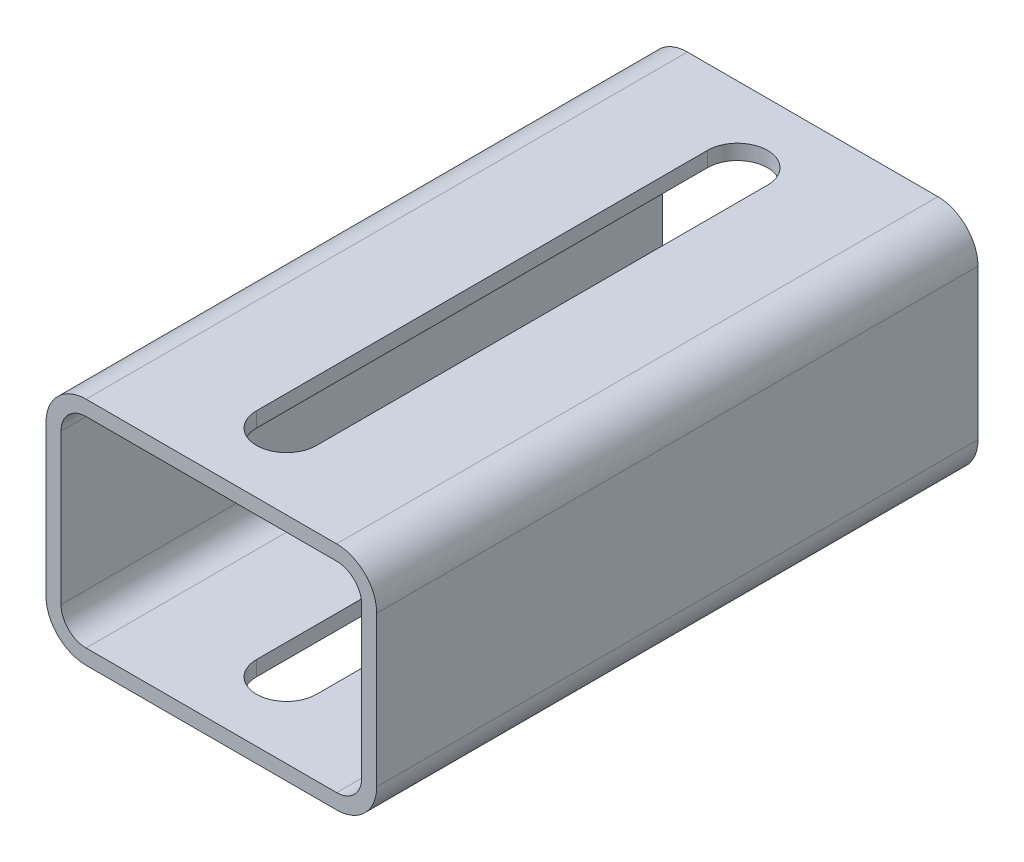
ISO-10303-21;
HEADER;
FILE_DESCRIPTION(('STEP AP214'),'2;1');
FILE_NAME('part.step','',(''),(''),'','','');
FILE_SCHEMA(('AUTOMOTIVE_DESIGN { 1 0 10303 214 1 1 1 1 }'));
ENDSEC;
DATA;
#1=APPLICATION_CONTEXT('core data for automotive mechanical design processes');
#2=APPLICATION_PROTOCOL_DEFINITION('international standard','automotive_design',2000,#1);
#3=PRODUCT_CONTEXT('',#1,'mechanical');
#4=PRODUCT('Part','Part','',(#3));
#5=PRODUCT_RELATED_PRODUCT_CATEGORY('part','',(#4));
#6=PRODUCT_DEFINITION_FORMATION('','',#4);
#7=PRODUCT_DEFINITION_CONTEXT('part definition',#1,'design');
#8=PRODUCT_DEFINITION('design','',#6,#7);
#9=PRODUCT_DEFINITION_SHAPE('','',#8);
#10=(LENGTH_UNIT() NAMED_UNIT(*) SI_UNIT(.MILLI.,.METRE.));
#11=(NAMED_UNIT(*) PLANE_ANGLE_UNIT() SI_UNIT($,.RADIAN.));
#12=(NAMED_UNIT(*) SI_UNIT($,.STERADIAN.) SOLID_ANGLE_UNIT());
#13=UNCERTAINTY_MEASURE_WITH_UNIT(LENGTH_MEASURE(1.E-05),#10,'distance_accuracy_value','');
#14=(GEOMETRIC_REPRESENTATION_CONTEXT(3) GLOBAL_UNCERTAINTY_ASSIGNED_CONTEXT((#13)) GLOBAL_UNIT_ASSIGNED_CONTEXT((#10,
#11,#12)) REPRESENTATION_CONTEXT('',''));
#15=CARTESIAN_POINT('',(0.,0.,0.));
#16=DIRECTION('',(0.,0.,1.));
#17=DIRECTION('',(1.,0.,0.));
#18=AXIS2_PLACEMENT_3D('',#15,#16,#17);
#19=CARTESIAN_POINT('',(25.,15.,60.));
#20=DIRECTION('',(0.,0.,-1.));
#21=DIRECTION('',(-1.,0.,0.));
#22=AXIS2_PLACEMENT_3D('',#19,#20,#21);
#23=PLANE('',#22);
#24=CARTESIAN_POINT('',(25.,15.,60.));
#25=DIRECTION('',(0.,0.,-1.));
#26=DIRECTION('',(-1.,0.,0.));
#27=AXIS2_PLACEMENT_3D('',#24,#25,#26);
#28=CIRCLE('',#27,8.);
#29=CARTESIAN_POINT('',(33.,15.,60.));
#30=VERTEX_POINT('',#29);
#31=CARTESIAN_POINT('',(25.,23.,60.));
#32=VERTEX_POINT('',#31);
#33=EDGE_CURVE('E404',#30,#32,#28,.F.);
#34=ORIENTED_EDGE('',*,*,#33,.T.);
#35=DIRECTION('',(-1.,0.,0.));
#36=VECTOR('',#35,1.);
#37=CARTESIAN_POINT('',(25.,23.,60.));
#38=LINE('',#37,#36);
#39=CARTESIAN_POINT('',(-25.,23.,60.));
#40=VERTEX_POINT('',#39);
#41=EDGE_CURVE('E408',#32,#40,#38,.T.);
#42=ORIENTED_EDGE('',*,*,#41,.T.);
#43=CARTESIAN_POINT('',(-25.,15.,60.));
#44=DIRECTION('',(0.,0.,-1.));
#45=DIRECTION('',(-1.,0.,0.));
#46=AXIS2_PLACEMENT_3D('',#43,#44,#45);
#47=CIRCLE('',#46,8.);
#48=CARTESIAN_POINT('',(-33.,14.9999999999999,60.));
#49=VERTEX_POINT('',#48);
#50=EDGE_CURVE('E412',#40,#49,#47,.F.);
#51=ORIENTED_EDGE('',*,*,#50,.T.);
#52=DIRECTION('',(0.,-1.,0.));
#53=VECTOR('',#52,1.);
#54=CARTESIAN_POINT('',(-33.,15.,60.));
#55=LINE('',#54,#53);
#56=CARTESIAN_POINT('',(-33.,-15.,60.));
#57=VERTEX_POINT('',#56);
#58=EDGE_CURVE('E415',#49,#57,#55,.T.);
#59=ORIENTED_EDGE('',*,*,#58,.T.);
#60=CARTESIAN_POINT('',(-25.,-15.,60.));
#61=DIRECTION('',(0.,0.,-1.));
#62=DIRECTION('',(-1.,0.,0.));
#63=AXIS2_PLACEMENT_3D('',#60,#61,#62);
#64=CIRCLE('',#63,8.);
#65=CARTESIAN_POINT('',(-24.9999999999999,-23.,60.));
#66=VERTEX_POINT('',#65);
#67=EDGE_CURVE('E418',#57,#66,#64,.F.);
#68=ORIENTED_EDGE('',*,*,#67,.T.);
#69=DIRECTION('',(1.,0.,0.));
#70=VECTOR('',#69,1.);
#71=CARTESIAN_POINT('',(25.,-23.,60.));
#72=LINE('',#71,#70);
#73=CARTESIAN_POINT('',(25.,-23.,60.));
#74=VERTEX_POINT('',#73);
#75=EDGE_CURVE('E421',#66,#74,#72,.T.);
#76=ORIENTED_EDGE('',*,*,#75,.T.);
#77=CARTESIAN_POINT('',(25.,-15.,60.));
#78=DIRECTION('',(0.,0.,-1.));
#79=DIRECTION('',(-1.,0.,0.));
#80=AXIS2_PLACEMENT_3D('',#77,#78,#79);
#81=CIRCLE('',#80,8.);
#82=CARTESIAN_POINT('',(33.,-15.,60.));
#83=VERTEX_POINT('',#82);
#84=EDGE_CURVE('E424',#74,#83,#81,.F.);
#85=ORIENTED_EDGE('',*,*,#84,.T.);
#86=DIRECTION('',(0.,1.,0.));
#87=VECTOR('',#86,1.);
#88=CARTESIAN_POINT('',(33.,15.,60.));
#89=LINE('',#88,#87);
#90=EDGE_CURVE('E427',#83,#30,#89,.T.);
#91=ORIENTED_EDGE('',*,*,#90,.T.);
#92=EDGE_LOOP('',(#34,#42,#51,#59,#68,#76,#85,#91));
#93=FACE_BOUND('',#92,.T.);
#94=CARTESIAN_POINT('',(25.,15.,60.));
#95=DIRECTION('',(0.,0.,1.));
#96=DIRECTION('',(-1.,0.,0.));
#97=AXIS2_PLACEMENT_3D('',#94,#95,#96);
#98=CIRCLE('',#97,5.);
#99=CARTESIAN_POINT('',(30.,15.,60.));
#100=VERTEX_POINT('',#99);
#101=CARTESIAN_POINT('',(25.,20.,60.));
#102=VERTEX_POINT('',#101);
#103=EDGE_CURVE('E321',#100,#102,#98,.T.);
#104=ORIENTED_EDGE('',*,*,#103,.F.);
#105=DIRECTION('',(0.,1.,0.));
#106=VECTOR('',#105,1.);
#107=CARTESIAN_POINT('',(30.,-15.,60.));
#108=LINE('',#107,#106);
#109=CARTESIAN_POINT('',(30.,-15.,60.));
#110=VERTEX_POINT('',#109);
#111=EDGE_CURVE('E344',#110,#100,#108,.T.);
#112=ORIENTED_EDGE('',*,*,#111,.F.);
#113=CARTESIAN_POINT('',(25.,-15.,60.));
#114=DIRECTION('',(0.,0.,1.));
#115=DIRECTION('',(1.,0.,0.));
#116=AXIS2_PLACEMENT_3D('',#113,#114,#115);
#117=CIRCLE('',#116,5.);
#118=CARTESIAN_POINT('',(25.,-20.,60.));
#119=VERTEX_POINT('',#118);
#120=EDGE_CURVE('E340',#119,#110,#117,.T.);
#121=ORIENTED_EDGE('',*,*,#120,.F.);
#122=DIRECTION('',(1.,0.,0.));
#123=VECTOR('',#122,1.);
#124=CARTESIAN_POINT('',(-25.,-20.,60.));
#125=LINE('',#124,#123);
#126=CARTESIAN_POINT('',(-25.,-20.,60.));
#127=VERTEX_POINT('',#126);
#128=EDGE_CURVE('E337',#127,#119,#125,.T.);
#129=ORIENTED_EDGE('',*,*,#128,.F.);
#130=CARTESIAN_POINT('',(-25.,-15.,60.));
#131=DIRECTION('',(0.,0.,1.));
#132=DIRECTION('',(-1.,0.,0.));
#133=AXIS2_PLACEMENT_3D('',#130,#131,#132);
#134=CIRCLE('',#133,5.);
#135=CARTESIAN_POINT('',(-30.,-15.,60.));
#136=VERTEX_POINT('',#135);
#137=EDGE_CURVE('E334',#136,#127,#134,.T.);
#138=ORIENTED_EDGE('',*,*,#137,.F.);
#139=DIRECTION('',(0.,-1.,0.));
#140=VECTOR('',#139,1.);
#141=CARTESIAN_POINT('',(-30.,-15.,60.));
#142=LINE('',#141,#140);
#143=CARTESIAN_POINT('',(-30.,15.,60.));
#144=VERTEX_POINT('',#143);
#145=EDGE_CURVE('E331',#144,#136,#142,.T.);
#146=ORIENTED_EDGE('',*,*,#145,.F.);
#147=CARTESIAN_POINT('',(-25.,15.,60.));
#148=DIRECTION('',(0.,0.,1.));
#149=DIRECTION('',(-1.,0.,0.));
#150=AXIS2_PLACEMENT_3D('',#147,#148,#149);
#151=CIRCLE('',#150,5.);
#152=CARTESIAN_POINT('',(-25.,20.,60.));
#153=VERTEX_POINT('',#152);
#154=EDGE_CURVE('E328',#153,#144,#151,.T.);
#155=ORIENTED_EDGE('',*,*,#154,.F.);
#156=DIRECTION('',(-1.,0.,0.));
#157=VECTOR('',#156,1.);
#158=CARTESIAN_POINT('',(-25.,20.,60.));
#159=LINE('',#158,#157);
#160=EDGE_CURVE('E324',#102,#153,#159,.T.);
#161=ORIENTED_EDGE('',*,*,#160,.F.);
#162=EDGE_LOOP('',(#104,#112,#121,#129,#138,#146,#155,#161));
#163=FACE_BOUND('',#162,.T.);
#164=ADVANCED_FACE('F87',(#93,#163),#23,.F.);
#165=CARTESIAN_POINT('',(25.,15.,-60.));
#166=DIRECTION('',(0.,0.,-1.));
#167=DIRECTION('',(-1.,0.,0.));
#168=AXIS2_PLACEMENT_3D('',#165,#166,#167);
#169=PLANE('',#168);
#170=CARTESIAN_POINT('',(25.,15.,-60.));
#171=DIRECTION('',(0.,0.,-1.));
#172=DIRECTION('',(-1.,0.,0.));
#173=AXIS2_PLACEMENT_3D('',#170,#171,#172);
#174=CIRCLE('',#173,8.);
#175=CARTESIAN_POINT('',(33.,15.,-60.));
#176=VERTEX_POINT('',#175);
#177=CARTESIAN_POINT('',(25.,23.,-60.));
#178=VERTEX_POINT('',#177);
#179=EDGE_CURVE('E403',#176,#178,#174,.F.);
#180=ORIENTED_EDGE('',*,*,#179,.F.);
#181=DIRECTION('',(0.,1.,0.));
#182=VECTOR('',#181,1.);
#183=CARTESIAN_POINT('',(33.,15.,-60.));
#184=LINE('',#183,#182);
#185=CARTESIAN_POINT('',(33.,-15.,-60.));
#186=VERTEX_POINT('',#185);
#187=EDGE_CURVE('E409',#186,#176,#184,.T.);
#188=ORIENTED_EDGE('',*,*,#187,.F.);
#189=CARTESIAN_POINT('',(25.,-15.,-60.));
#190=DIRECTION('',(0.,0.,-1.));
#191=DIRECTION('',(-1.,0.,0.));
#192=AXIS2_PLACEMENT_3D('',#189,#190,#191);
#193=CIRCLE('',#192,8.);
#194=CARTESIAN_POINT('',(25.,-23.,-60.));
#195=VERTEX_POINT('',#194);
#196=EDGE_CURVE('E449',#195,#186,#193,.F.);
#197=ORIENTED_EDGE('',*,*,#196,.F.);
#198=DIRECTION('',(1.,0.,0.));
#199=VECTOR('',#198,1.);
#200=CARTESIAN_POINT('',(25.,-23.,-60.));
#201=LINE('',#200,#199);
#202=CARTESIAN_POINT('',(-24.9999999999999,-23.,-60.));
#203=VERTEX_POINT('',#202);
#204=EDGE_CURVE('E446',#203,#195,#201,.T.);
#205=ORIENTED_EDGE('',*,*,#204,.F.);
#206=CARTESIAN_POINT('',(-25.,-15.,-60.));
#207=DIRECTION('',(0.,0.,-1.));
#208=DIRECTION('',(-1.,0.,0.));
#209=AXIS2_PLACEMENT_3D('',#206,#207,#208);
#210=CIRCLE('',#209,8.);
#211=CARTESIAN_POINT('',(-33.,-15.,-60.));
#212=VERTEX_POINT('',#211);
#213=EDGE_CURVE('E443',#212,#203,#210,.F.);
#214=ORIENTED_EDGE('',*,*,#213,.F.);
#215=DIRECTION('',(0.,-1.,0.));
#216=VECTOR('',#215,1.);
#217=CARTESIAN_POINT('',(-33.,15.,-60.));
#218=LINE('',#217,#216);
#219=CARTESIAN_POINT('',(-33.,14.9999999999999,-60.));
#220=VERTEX_POINT('',#219);
#221=EDGE_CURVE('E440',#220,#212,#218,.T.);
#222=ORIENTED_EDGE('',*,*,#221,.F.);
#223=CARTESIAN_POINT('',(-25.,15.,-60.));
#224=DIRECTION('',(0.,0.,-1.));
#225=DIRECTION('',(-1.,0.,0.));
#226=AXIS2_PLACEMENT_3D('',#223,#224,#225);
#227=CIRCLE('',#226,8.);
#228=CARTESIAN_POINT('',(-25.,23.,-60.));
#229=VERTEX_POINT('',#228);
#230=EDGE_CURVE('E437',#229,#220,#227,.F.);
#231=ORIENTED_EDGE('',*,*,#230,.F.);
#232=DIRECTION('',(-1.,0.,0.));
#233=VECTOR('',#232,1.);
#234=CARTESIAN_POINT('',(25.,23.,-60.));
#235=LINE('',#234,#233);
#236=EDGE_CURVE('E434',#178,#229,#235,.T.);
#237=ORIENTED_EDGE('',*,*,#236,.F.);
#238=EDGE_LOOP('',(#180,#188,#197,#205,#214,#222,#231,#237));
#239=FACE_BOUND('',#238,.T.);
#240=DIRECTION('',(0.,1.,0.));
#241=VECTOR('',#240,1.);
#242=CARTESIAN_POINT('',(30.,-15.,-60.));
#243=LINE('',#242,#241);
#244=CARTESIAN_POINT('',(30.,-15.,-60.));
#245=VERTEX_POINT('',#244);
#246=CARTESIAN_POINT('',(30.,15.,-60.));
#247=VERTEX_POINT('',#246);
#248=EDGE_CURVE('E325',#245,#247,#243,.T.);
#249=ORIENTED_EDGE('',*,*,#248,.T.);
#250=CARTESIAN_POINT('',(25.,15.,-60.));
#251=DIRECTION('',(0.,0.,1.));
#252=DIRECTION('',(-1.,0.,0.));
#253=AXIS2_PLACEMENT_3D('',#250,#251,#252);
#254=CIRCLE('',#253,5.);
#255=CARTESIAN_POINT('',(25.,20.,-60.));
#256=VERTEX_POINT('',#255);
#257=EDGE_CURVE('E320',#247,#256,#254,.T.);
#258=ORIENTED_EDGE('',*,*,#257,.T.);
#259=DIRECTION('',(-1.,0.,0.));
#260=VECTOR('',#259,1.);
#261=CARTESIAN_POINT('',(-25.,20.,-60.));
#262=LINE('',#261,#260);
#263=CARTESIAN_POINT('',(-25.,20.,-60.));
#264=VERTEX_POINT('',#263);
#265=EDGE_CURVE('E351',#256,#264,#262,.T.);
#266=ORIENTED_EDGE('',*,*,#265,.T.);
#267=CARTESIAN_POINT('',(-25.,15.,-60.));
#268=DIRECTION('',(0.,0.,1.));
#269=DIRECTION('',(-1.,0.,0.));
#270=AXIS2_PLACEMENT_3D('',#267,#268,#269);
#271=CIRCLE('',#270,5.);
#272=CARTESIAN_POINT('',(-30.,15.,-60.));
#273=VERTEX_POINT('',#272);
#274=EDGE_CURVE('E355',#264,#273,#271,.T.);
#275=ORIENTED_EDGE('',*,*,#274,.T.);
#276=DIRECTION('',(0.,-1.,0.));
#277=VECTOR('',#276,1.);
#278=CARTESIAN_POINT('',(-30.,-15.,-60.));
#279=LINE('',#278,#277);
#280=CARTESIAN_POINT('',(-30.,-15.,-60.));
#281=VERTEX_POINT('',#280);
#282=EDGE_CURVE('E359',#273,#281,#279,.T.);
#283=ORIENTED_EDGE('',*,*,#282,.T.);
#284=CARTESIAN_POINT('',(-25.,-15.,-60.));
#285=DIRECTION('',(0.,0.,1.));
#286=DIRECTION('',(-1.,0.,0.));
#287=AXIS2_PLACEMENT_3D('',#284,#285,#286);
#288=CIRCLE('',#287,5.);
#289=CARTESIAN_POINT('',(-25.,-20.,-60.));
#290=VERTEX_POINT('',#289);
#291=EDGE_CURVE('E363',#281,#290,#288,.T.);
#292=ORIENTED_EDGE('',*,*,#291,.T.);
#293=DIRECTION('',(1.,0.,0.));
#294=VECTOR('',#293,1.);
#295=CARTESIAN_POINT('',(-25.,-20.,-60.));
#296=LINE('',#295,#294);
#297=CARTESIAN_POINT('',(25.,-20.,-60.));
#298=VERTEX_POINT('',#297);
#299=EDGE_CURVE('E367',#290,#298,#296,.T.);
#300=ORIENTED_EDGE('',*,*,#299,.T.);
#301=CARTESIAN_POINT('',(25.,-15.,-60.));
#302=DIRECTION('',(0.,0.,1.));
#303=DIRECTION('',(1.,0.,0.));
#304=AXIS2_PLACEMENT_3D('',#301,#302,#303);
#305=CIRCLE('',#304,5.);
#306=EDGE_CURVE('E371',#298,#245,#305,.T.);
#307=ORIENTED_EDGE('',*,*,#306,.T.);
#308=EDGE_LOOP('',(#249,#258,#266,#275,#283,#292,#300,#307));
#309=FACE_BOUND('',#308,.T.);
#310=ADVANCED_FACE('F514',(#239,#309),#169,.T.);
#311=CARTESIAN_POINT('',(25.,15.,60.));
#312=DIRECTION('',(0.,0.,-1.));
#313=DIRECTION('',(-1.,0.,0.));
#314=AXIS2_PLACEMENT_3D('',#311,#312,#313);
#315=CYLINDRICAL_SURFACE('',#314,8.);
#316=ORIENTED_EDGE('',*,*,#179,.T.);
#317=DIRECTION('',(0.,0.,-1.));
#318=VECTOR('',#317,1.);
#319=CARTESIAN_POINT('',(25.,23.,60.));
#320=LINE('',#319,#318);
#321=EDGE_CURVE('E481',#32,#178,#320,.T.);
#322=ORIENTED_EDGE('',*,*,#321,.F.);
#323=ORIENTED_EDGE('',*,*,#33,.F.);
#324=DIRECTION('',(0.,0.,-1.));
#325=VECTOR('',#324,1.);
#326=CARTESIAN_POINT('',(33.,15.,60.));
#327=LINE('',#326,#325);
#328=EDGE_CURVE('E430',#30,#176,#327,.T.);
#329=ORIENTED_EDGE('',*,*,#328,.T.);
#330=EDGE_LOOP('',(#316,#322,#323,#329));
#331=FACE_BOUND('',#330,.T.);
#332=ADVANCED_FACE('F89',(#331),#315,.T.);
#333=CARTESIAN_POINT('',(25.,23.,60.));
#334=DIRECTION('',(0.,-1.,0.));
#335=DIRECTION('',(0.,0.,-1.));
#336=AXIS2_PLACEMENT_3D('',#333,#334,#335);
#337=PLANE('',#336);
#338=DIRECTION('',(0.,0.,1.));
#339=VECTOR('',#338,1.);
#340=CARTESIAN_POINT('',(-5.99999999999997,23.,-45.));
#341=LINE('',#340,#339);
#342=CARTESIAN_POINT('',(-5.99999999999997,23.,-45.));
#343=VERTEX_POINT('',#342);
#344=CARTESIAN_POINT('',(-5.99999999999997,23.,45.));
#345=VERTEX_POINT('',#344);
#346=EDGE_CURVE('E289',#343,#345,#341,.T.);
#347=ORIENTED_EDGE('',*,*,#346,.F.);
#348=CARTESIAN_POINT('',(0.,23.,-45.));
#349=DIRECTION('',(0.,1.,0.));
#350=DIRECTION('',(0.,0.,1.));
#351=AXIS2_PLACEMENT_3D('',#348,#349,#350);
#352=CIRCLE('',#351,5.99999999999998);
#353=CARTESIAN_POINT('',(5.99999999999999,23.,-45.));
#354=VERTEX_POINT('',#353);
#355=EDGE_CURVE('E103',#354,#343,#352,.T.);
#356=ORIENTED_EDGE('',*,*,#355,.F.);
#357=DIRECTION('',(0.,0.,-1.));
#358=VECTOR('',#357,1.);
#359=CARTESIAN_POINT('',(5.99999999999999,23.,-45.));
#360=LINE('',#359,#358);
#361=CARTESIAN_POINT('',(5.99999999999999,23.,45.));
#362=VERTEX_POINT('',#361);
#363=EDGE_CURVE('E276',#362,#354,#360,.T.);
#364=ORIENTED_EDGE('',*,*,#363,.F.);
#365=CARTESIAN_POINT('',(0.,23.,45.));
#366=DIRECTION('',(0.,1.,0.));
#367=DIRECTION('',(0.,0.,1.));
#368=AXIS2_PLACEMENT_3D('',#365,#366,#367);
#369=CIRCLE('',#368,5.99999999999998);
#370=EDGE_CURVE('E280',#345,#362,#369,.T.);
#371=ORIENTED_EDGE('',*,*,#370,.F.);
#372=EDGE_LOOP('',(#347,#356,#364,#371));
#373=FACE_BOUND('',#372,.T.);
#374=ORIENTED_EDGE('',*,*,#236,.T.);
#375=DIRECTION('',(0.,0.,-1.));
#376=VECTOR('',#375,1.);
#377=CARTESIAN_POINT('',(-25.,23.,60.));
#378=LINE('',#377,#376);
#379=EDGE_CURVE('E477',#40,#229,#378,.T.);
#380=ORIENTED_EDGE('',*,*,#379,.F.);
#381=ORIENTED_EDGE('',*,*,#41,.F.);
#382=ORIENTED_EDGE('',*,*,#321,.T.);
#383=EDGE_LOOP('',(#374,#380,#381,#382));
#384=FACE_BOUND('',#383,.T.);
#385=ADVANCED_FACE('F547',(#373,#384),#337,.F.);
#386=CARTESIAN_POINT('',(-25.,15.,60.));
#387=DIRECTION('',(0.,0.,-1.));
#388=DIRECTION('',(-1.,0.,0.));
#389=AXIS2_PLACEMENT_3D('',#386,#387,#388);
#390=CYLINDRICAL_SURFACE('',#389,8.);
#391=ORIENTED_EDGE('',*,*,#230,.T.);
#392=DIRECTION('',(0.,0.,-1.));
#393=VECTOR('',#392,1.);
#394=CARTESIAN_POINT('',(-33.,14.9999999999999,60.));
#395=LINE('',#394,#393);
#396=EDGE_CURVE('E473',#49,#220,#395,.T.);
#397=ORIENTED_EDGE('',*,*,#396,.F.);
#398=ORIENTED_EDGE('',*,*,#50,.F.);
#399=ORIENTED_EDGE('',*,*,#379,.T.);
#400=EDGE_LOOP('',(#391,#397,#398,#399));
#401=FACE_BOUND('',#400,.T.);
#402=ADVANCED_FACE('F544',(#401),#390,.T.);
#403=CARTESIAN_POINT('',(-33.,15.,60.));
#404=DIRECTION('',(1.,0.,0.));
#405=DIRECTION('',(0.,0.,-1.));
#406=AXIS2_PLACEMENT_3D('',#403,#404,#405);
#407=PLANE('',#406);
#408=ORIENTED_EDGE('',*,*,#221,.T.);
#409=DIRECTION('',(0.,0.,-1.));
#410=VECTOR('',#409,1.);
#411=CARTESIAN_POINT('',(-33.,-15.,60.));
#412=LINE('',#411,#410);
#413=EDGE_CURVE('E469',#57,#212,#412,.T.);
#414=ORIENTED_EDGE('',*,*,#413,.F.);
#415=ORIENTED_EDGE('',*,*,#58,.F.);
#416=ORIENTED_EDGE('',*,*,#396,.T.);
#417=EDGE_LOOP('',(#408,#414,#415,#416));
#418=FACE_BOUND('',#417,.T.);
#419=ADVANCED_FACE('F540',(#418),#407,.F.);
#420=CARTESIAN_POINT('',(-25.,-15.,60.));
#421=DIRECTION('',(0.,0.,-1.));
#422=DIRECTION('',(-1.,0.,0.));
#423=AXIS2_PLACEMENT_3D('',#420,#421,#422);
#424=CYLINDRICAL_SURFACE('',#423,8.);
#425=ORIENTED_EDGE('',*,*,#213,.T.);
#426=DIRECTION('',(0.,0.,-1.));
#427=VECTOR('',#426,1.);
#428=CARTESIAN_POINT('',(-24.9999999999999,-23.,60.));
#429=LINE('',#428,#427);
#430=EDGE_CURVE('E465',#66,#203,#429,.T.);
#431=ORIENTED_EDGE('',*,*,#430,.F.);
#432=ORIENTED_EDGE('',*,*,#67,.F.);
#433=ORIENTED_EDGE('',*,*,#413,.T.);
#434=EDGE_LOOP('',(#425,#431,#432,#433));
#435=FACE_BOUND('',#434,.T.);
#436=ADVANCED_FACE('F537',(#435),#424,.T.);
#437=CARTESIAN_POINT('',(25.,-23.,60.));
#438=DIRECTION('',(0.,1.,0.));
#439=DIRECTION('',(0.,0.,1.));
#440=AXIS2_PLACEMENT_3D('',#437,#438,#439);
#441=PLANE('',#440);
#442=DIRECTION('',(0.,0.,-1.));
#443=VECTOR('',#442,1.);
#444=CARTESIAN_POINT('',(5.99999999999999,-23.,-45.));
#445=LINE('',#444,#443);
#446=CARTESIAN_POINT('',(5.99999999999999,-23.,45.));
#447=VERTEX_POINT('',#446);
#448=CARTESIAN_POINT('',(5.99999999999999,-23.,-45.));
#449=VERTEX_POINT('',#448);
#450=EDGE_CURVE('E274',#447,#449,#445,.T.);
#451=ORIENTED_EDGE('',*,*,#450,.T.);
#452=CARTESIAN_POINT('',(0.,-23.,-45.));
#453=DIRECTION('',(0.,1.,0.));
#454=DIRECTION('',(0.,0.,1.));
#455=AXIS2_PLACEMENT_3D('',#452,#453,#454);
#456=CIRCLE('',#455,5.99999999999998);
#457=CARTESIAN_POINT('',(-5.99999999999997,-23.,-45.));
#458=VERTEX_POINT('',#457);
#459=EDGE_CURVE('E255',#449,#458,#456,.T.);
#460=ORIENTED_EDGE('',*,*,#459,.T.);
#461=DIRECTION('',(0.,0.,1.));
#462=VECTOR('',#461,1.);
#463=CARTESIAN_POINT('',(-5.99999999999997,-23.,-45.));
#464=LINE('',#463,#462);
#465=CARTESIAN_POINT('',(-5.99999999999997,-23.,45.));
#466=VERTEX_POINT('',#465);
#467=EDGE_CURVE('E265',#458,#466,#464,.T.);
#468=ORIENTED_EDGE('',*,*,#467,.T.);
#469=CARTESIAN_POINT('',(0.,-23.,45.));
#470=DIRECTION('',(0.,1.,0.));
#471=DIRECTION('',(0.,0.,1.));
#472=AXIS2_PLACEMENT_3D('',#469,#470,#471);
#473=CIRCLE('',#472,5.99999999999998);
#474=EDGE_CURVE('E111',#466,#447,#473,.T.);
#475=ORIENTED_EDGE('',*,*,#474,.T.);
#476=EDGE_LOOP('',(#451,#460,#468,#475));
#477=FACE_BOUND('',#476,.T.);
#478=ORIENTED_EDGE('',*,*,#204,.T.);
#479=DIRECTION('',(0.,0.,-1.));
#480=VECTOR('',#479,1.);
#481=CARTESIAN_POINT('',(25.,-23.,60.));
#482=LINE('',#481,#480);
#483=EDGE_CURVE('E461',#74,#195,#482,.T.);
#484=ORIENTED_EDGE('',*,*,#483,.F.);
#485=ORIENTED_EDGE('',*,*,#75,.F.);
#486=ORIENTED_EDGE('',*,*,#430,.T.);
#487=EDGE_LOOP('',(#478,#484,#485,#486));
#488=FACE_BOUND('',#487,.T.);
#489=ADVANCED_FACE('F271',(#477,#488),#441,.F.);
#490=CARTESIAN_POINT('',(25.,-15.,60.));
#491=DIRECTION('',(0.,0.,-1.));
#492=DIRECTION('',(-1.,0.,0.));
#493=AXIS2_PLACEMENT_3D('',#490,#491,#492);
#494=CYLINDRICAL_SURFACE('',#493,8.);
#495=ORIENTED_EDGE('',*,*,#196,.T.);
#496=DIRECTION('',(0.,0.,-1.));
#497=VECTOR('',#496,1.);
#498=CARTESIAN_POINT('',(33.,-15.,60.));
#499=LINE('',#498,#497);
#500=EDGE_CURVE('E457',#83,#186,#499,.T.);
#501=ORIENTED_EDGE('',*,*,#500,.F.);
#502=ORIENTED_EDGE('',*,*,#84,.F.);
#503=ORIENTED_EDGE('',*,*,#483,.T.);
#504=EDGE_LOOP('',(#495,#501,#502,#503));
#505=FACE_BOUND('',#504,.T.);
#506=ADVANCED_FACE('F530',(#505),#494,.T.);
#507=CARTESIAN_POINT('',(33.,15.,60.));
#508=DIRECTION('',(-1.,0.,0.));
#509=DIRECTION('',(0.,0.,1.));
#510=AXIS2_PLACEMENT_3D('',#507,#508,#509);
#511=PLANE('',#510);
#512=ORIENTED_EDGE('',*,*,#187,.T.);
#513=ORIENTED_EDGE('',*,*,#328,.F.);
#514=ORIENTED_EDGE('',*,*,#90,.F.);
#515=ORIENTED_EDGE('',*,*,#500,.T.);
#516=EDGE_LOOP('',(#512,#513,#514,#515));
#517=FACE_BOUND('',#516,.T.);
#518=ADVANCED_FACE('F527',(#517),#511,.F.);
#519=CARTESIAN_POINT('',(25.,15.,60.));
#520=DIRECTION('',(0.,0.,-1.));
#521=DIRECTION('',(-1.,0.,0.));
#522=AXIS2_PLACEMENT_3D('',#519,#520,#521);
#523=CYLINDRICAL_SURFACE('',#522,5.);
#524=ORIENTED_EDGE('',*,*,#257,.F.);
#525=DIRECTION('',(0.,0.,-1.));
#526=VECTOR('',#525,1.);
#527=CARTESIAN_POINT('',(30.,15.,60.));
#528=LINE('',#527,#526);
#529=EDGE_CURVE('E347',#100,#247,#528,.T.);
#530=ORIENTED_EDGE('',*,*,#529,.F.);
#531=ORIENTED_EDGE('',*,*,#103,.T.);
#532=DIRECTION('',(0.,0.,-1.));
#533=VECTOR('',#532,1.);
#534=CARTESIAN_POINT('',(25.,20.,60.));
#535=LINE('',#534,#533);
#536=EDGE_CURVE('E399',#102,#256,#535,.T.);
#537=ORIENTED_EDGE('',*,*,#536,.T.);
#538=EDGE_LOOP('',(#524,#530,#531,#537));
#539=FACE_BOUND('',#538,.T.);
#540=ADVANCED_FACE('F524',(#539),#523,.F.);
#541=CARTESIAN_POINT('',(-25.,20.,60.));
#542=DIRECTION('',(0.,-1.,0.));
#543=DIRECTION('',(0.,0.,-1.));
#544=AXIS2_PLACEMENT_3D('',#541,#542,#543);
#545=PLANE('',#544);
#546=CARTESIAN_POINT('',(0.,20.,-45.));
#547=DIRECTION('',(0.,-1.,0.));
#548=DIRECTION('',(0.,0.,-1.));
#549=AXIS2_PLACEMENT_3D('',#546,#547,#548);
#550=CIRCLE('',#549,5.99999999999998);
#551=CARTESIAN_POINT('',(-5.99999999999997,20.,-45.));
#552=VERTEX_POINT('',#551);
#553=CARTESIAN_POINT('',(5.99999999999999,20.,-45.));
#554=VERTEX_POINT('',#553);
#555=EDGE_CURVE('E317',#552,#554,#550,.T.);
#556=ORIENTED_EDGE('',*,*,#555,.F.);
#557=DIRECTION('',(0.,0.,-1.));
#558=VECTOR('',#557,1.);
#559=CARTESIAN_POINT('',(-5.99999999999997,20.,60.));
#560=LINE('',#559,#558);
#561=CARTESIAN_POINT('',(-5.99999999999997,20.,45.));
#562=VERTEX_POINT('',#561);
#563=EDGE_CURVE('E299',#562,#552,#560,.T.);
#564=ORIENTED_EDGE('',*,*,#563,.F.);
#565=CARTESIAN_POINT('',(0.,20.,45.));
#566=DIRECTION('',(0.,-1.,0.));
#567=DIRECTION('',(0.,0.,-1.));
#568=AXIS2_PLACEMENT_3D('',#565,#566,#567);
#569=CIRCLE('',#568,5.99999999999998);
#570=CARTESIAN_POINT('',(5.99999999999999,20.,45.));
#571=VERTEX_POINT('',#570);
#572=EDGE_CURVE('E310',#571,#562,#569,.T.);
#573=ORIENTED_EDGE('',*,*,#572,.F.);
#574=DIRECTION('',(0.,0.,1.));
#575=VECTOR('',#574,1.);
#576=CARTESIAN_POINT('',(5.99999999999999,20.,60.));
#577=LINE('',#576,#575);
#578=EDGE_CURVE('E314',#554,#571,#577,.T.);
#579=ORIENTED_EDGE('',*,*,#578,.F.);
#580=EDGE_LOOP('',(#556,#564,#573,#579));
#581=FACE_BOUND('',#580,.T.);
#582=ORIENTED_EDGE('',*,*,#265,.F.);
#583=ORIENTED_EDGE('',*,*,#536,.F.);
#584=ORIENTED_EDGE('',*,*,#160,.T.);
#585=DIRECTION('',(0.,0.,-1.));
#586=VECTOR('',#585,1.);
#587=CARTESIAN_POINT('',(-25.,20.,60.));
#588=LINE('',#587,#586);
#589=EDGE_CURVE('E396',#153,#264,#588,.T.);
#590=ORIENTED_EDGE('',*,*,#589,.T.);
#591=EDGE_LOOP('',(#582,#583,#584,#590));
#592=FACE_BOUND('',#591,.T.);
#593=ADVANCED_FACE('F595',(#581,#592),#545,.T.);
#594=CARTESIAN_POINT('',(-25.,15.,60.));
#595=DIRECTION('',(0.,0.,-1.));
#596=DIRECTION('',(-1.,0.,0.));
#597=AXIS2_PLACEMENT_3D('',#594,#595,#596);
#598=CYLINDRICAL_SURFACE('',#597,5.);
#599=ORIENTED_EDGE('',*,*,#274,.F.);
#600=ORIENTED_EDGE('',*,*,#589,.F.);
#601=ORIENTED_EDGE('',*,*,#154,.T.);
#602=DIRECTION('',(0.,0.,-1.));
#603=VECTOR('',#602,1.);
#604=CARTESIAN_POINT('',(-30.,15.,60.));
#605=LINE('',#604,#603);
#606=EDGE_CURVE('E393',#144,#273,#605,.T.);
#607=ORIENTED_EDGE('',*,*,#606,.T.);
#608=EDGE_LOOP('',(#599,#600,#601,#607));
#609=FACE_BOUND('',#608,.T.);
#610=ADVANCED_FACE('F598',(#609),#598,.F.);
#611=CARTESIAN_POINT('',(-30.,-15.,60.));
#612=DIRECTION('',(1.,0.,0.));
#613=DIRECTION('',(0.,0.,-1.));
#614=AXIS2_PLACEMENT_3D('',#611,#612,#613);
#615=PLANE('',#614);
#616=ORIENTED_EDGE('',*,*,#282,.F.);
#617=ORIENTED_EDGE('',*,*,#606,.F.);
#618=ORIENTED_EDGE('',*,*,#145,.T.);
#619=DIRECTION('',(0.,0.,-1.));
#620=VECTOR('',#619,1.);
#621=CARTESIAN_POINT('',(-30.,-15.,60.));
#622=LINE('',#621,#620);
#623=EDGE_CURVE('E390',#136,#281,#622,.T.);
#624=ORIENTED_EDGE('',*,*,#623,.T.);
#625=EDGE_LOOP('',(#616,#617,#618,#624));
#626=FACE_BOUND('',#625,.T.);
#627=ADVANCED_FACE('F603',(#626),#615,.T.);
#628=CARTESIAN_POINT('',(-25.,-15.,60.));
#629=DIRECTION('',(0.,0.,-1.));
#630=DIRECTION('',(-1.,0.,0.));
#631=AXIS2_PLACEMENT_3D('',#628,#629,#630);
#632=CYLINDRICAL_SURFACE('',#631,5.);
#633=ORIENTED_EDGE('',*,*,#291,.F.);
#634=ORIENTED_EDGE('',*,*,#623,.F.);
#635=ORIENTED_EDGE('',*,*,#137,.T.);
#636=DIRECTION('',(0.,0.,-1.));
#637=VECTOR('',#636,1.);
#638=CARTESIAN_POINT('',(-25.,-20.,60.));
#639=LINE('',#638,#637);
#640=EDGE_CURVE('E387',#127,#290,#639,.T.);
#641=ORIENTED_EDGE('',*,*,#640,.T.);
#642=EDGE_LOOP('',(#633,#634,#635,#641));
#643=FACE_BOUND('',#642,.T.);
#644=ADVANCED_FACE('F607',(#643),#632,.F.);
#645=CARTESIAN_POINT('',(-25.,-20.,60.));
#646=DIRECTION('',(0.,1.,0.));
#647=DIRECTION('',(0.,0.,1.));
#648=AXIS2_PLACEMENT_3D('',#645,#646,#647);
#649=PLANE('',#648);
#650=CARTESIAN_POINT('',(0.,-20.,-45.));
#651=DIRECTION('',(0.,1.,0.));
#652=DIRECTION('',(0.,0.,1.));
#653=AXIS2_PLACEMENT_3D('',#650,#651,#652);
#654=CIRCLE('',#653,5.99999999999998);
#655=CARTESIAN_POINT('',(5.99999999999999,-20.,-45.));
#656=VERTEX_POINT('',#655);
#657=CARTESIAN_POINT('',(-5.99999999999997,-20.,-45.));
#658=VERTEX_POINT('',#657);
#659=EDGE_CURVE('E12',#656,#658,#654,.T.);
#660=ORIENTED_EDGE('',*,*,#659,.F.);
#661=DIRECTION('',(0.,0.,-1.));
#662=VECTOR('',#661,1.);
#663=CARTESIAN_POINT('',(5.99999999999999,-20.,60.));
#664=LINE('',#663,#662);
#665=CARTESIAN_POINT('',(5.99999999999999,-20.,45.));
#666=VERTEX_POINT('',#665);
#667=EDGE_CURVE('E96',#666,#656,#664,.T.);
#668=ORIENTED_EDGE('',*,*,#667,.F.);
#669=CARTESIAN_POINT('',(0.,-20.,45.));
#670=DIRECTION('',(0.,1.,0.));
#671=DIRECTION('',(0.,0.,1.));
#672=AXIS2_PLACEMENT_3D('',#669,#670,#671);
#673=CIRCLE('',#672,5.99999999999998);
#674=CARTESIAN_POINT('',(-5.99999999999997,-20.,45.));
#675=VERTEX_POINT('',#674);
#676=EDGE_CURVE('E488',#675,#666,#673,.T.);
#677=ORIENTED_EDGE('',*,*,#676,.F.);
#678=DIRECTION('',(0.,0.,1.));
#679=VECTOR('',#678,1.);
#680=CARTESIAN_POINT('',(-5.99999999999997,-20.,60.));
#681=LINE('',#680,#679);
#682=EDGE_CURVE('E485',#658,#675,#681,.T.);
#683=ORIENTED_EDGE('',*,*,#682,.F.);
#684=EDGE_LOOP('',(#660,#668,#677,#683));
#685=FACE_BOUND('',#684,.T.);
#686=ORIENTED_EDGE('',*,*,#299,.F.);
#687=ORIENTED_EDGE('',*,*,#640,.F.);
#688=ORIENTED_EDGE('',*,*,#128,.T.);
#689=DIRECTION('',(0.,0.,-1.));
#690=VECTOR('',#689,1.);
#691=CARTESIAN_POINT('',(25.,-20.,60.));
#692=LINE('',#691,#690);
#693=EDGE_CURVE('E384',#119,#298,#692,.T.);
#694=ORIENTED_EDGE('',*,*,#693,.T.);
#695=EDGE_LOOP('',(#686,#687,#688,#694));
#696=FACE_BOUND('',#695,.T.);
#697=ADVANCED_FACE('F496',(#685,#696),#649,.T.);
#698=CARTESIAN_POINT('',(25.,-15.,60.));
#699=DIRECTION('',(0.,0.,-1.));
#700=DIRECTION('',(-1.,0.,0.));
#701=AXIS2_PLACEMENT_3D('',#698,#699,#700);
#702=CYLINDRICAL_SURFACE('',#701,5.);
#703=ORIENTED_EDGE('',*,*,#306,.F.);
#704=ORIENTED_EDGE('',*,*,#693,.F.);
#705=ORIENTED_EDGE('',*,*,#120,.T.);
#706=DIRECTION('',(0.,0.,-1.));
#707=VECTOR('',#706,1.);
#708=CARTESIAN_POINT('',(30.,-15.,60.));
#709=LINE('',#708,#707);
#710=EDGE_CURVE('E381',#110,#245,#709,.T.);
#711=ORIENTED_EDGE('',*,*,#710,.T.);
#712=EDGE_LOOP('',(#703,#704,#705,#711));
#713=FACE_BOUND('',#712,.T.);
#714=ADVANCED_FACE('F613',(#713),#702,.F.);
#715=CARTESIAN_POINT('',(30.,-15.,60.));
#716=DIRECTION('',(-1.,0.,0.));
#717=DIRECTION('',(0.,0.,1.));
#718=AXIS2_PLACEMENT_3D('',#715,#716,#717);
#719=PLANE('',#718);
#720=ORIENTED_EDGE('',*,*,#248,.F.);
#721=ORIENTED_EDGE('',*,*,#710,.F.);
#722=ORIENTED_EDGE('',*,*,#111,.T.);
#723=ORIENTED_EDGE('',*,*,#529,.T.);
#724=EDGE_LOOP('',(#720,#721,#722,#723));
#725=FACE_BOUND('',#724,.T.);
#726=ADVANCED_FACE('F508',(#725),#719,.T.);
#727=CARTESIAN_POINT('',(-5.99999999999997,-23.,-45.));
#728=DIRECTION('',(-1.,0.,0.));
#729=DIRECTION('',(0.,0.,1.));
#730=AXIS2_PLACEMENT_3D('',#727,#728,#729);
#731=PLANE('',#730);
#732=ORIENTED_EDGE('',*,*,#682,.T.);
#733=DIRECTION('',(0.,1.,0.));
#734=VECTOR('',#733,1.);
#735=CARTESIAN_POINT('',(-5.99999999999997,-23.,45.));
#736=LINE('',#735,#734);
#737=EDGE_CURVE('E267',#466,#675,#736,.T.);
#738=ORIENTED_EDGE('',*,*,#737,.F.);
#739=ORIENTED_EDGE('',*,*,#467,.F.);
#740=DIRECTION('',(0.,1.,0.));
#741=VECTOR('',#740,1.);
#742=CARTESIAN_POINT('',(-5.99999999999997,-23.,-45.));
#743=LINE('',#742,#741);
#744=EDGE_CURVE('E250',#458,#658,#743,.T.);
#745=ORIENTED_EDGE('',*,*,#744,.T.);
#746=EDGE_LOOP('',(#732,#738,#739,#745));
#747=FACE_BOUND('',#746,.T.);
#748=ADVANCED_FACE('F266',(#747),#731,.F.);
#749=CARTESIAN_POINT('',(0.,-23.,45.));
#750=DIRECTION('',(0.,1.,0.));
#751=DIRECTION('',(0.,0.,1.));
#752=AXIS2_PLACEMENT_3D('',#749,#750,#751);
#753=CYLINDRICAL_SURFACE('',#752,5.99999999999998);
#754=ORIENTED_EDGE('',*,*,#676,.T.);
#755=DIRECTION('',(0.,1.,0.));
#756=VECTOR('',#755,1.);
#757=CARTESIAN_POINT('',(5.99999999999999,-23.,45.));
#758=LINE('',#757,#756);
#759=EDGE_CURVE('E301',#447,#666,#758,.T.);
#760=ORIENTED_EDGE('',*,*,#759,.F.);
#761=ORIENTED_EDGE('',*,*,#474,.F.);
#762=ORIENTED_EDGE('',*,*,#737,.T.);
#763=EDGE_LOOP('',(#754,#760,#761,#762));
#764=FACE_BOUND('',#763,.T.);
#765=ADVANCED_FACE('F498',(#764),#753,.F.);
#766=CARTESIAN_POINT('',(5.99999999999999,-23.,-45.));
#767=DIRECTION('',(1.,0.,0.));
#768=DIRECTION('',(0.,0.,-1.));
#769=AXIS2_PLACEMENT_3D('',#766,#767,#768);
#770=PLANE('',#769);
#771=ORIENTED_EDGE('',*,*,#667,.T.);
#772=DIRECTION('',(0.,1.,0.));
#773=VECTOR('',#772,1.);
#774=CARTESIAN_POINT('',(5.99999999999999,-23.,-45.));
#775=LINE('',#774,#773);
#776=EDGE_CURVE('E296',#449,#656,#775,.T.);
#777=ORIENTED_EDGE('',*,*,#776,.F.);
#778=ORIENTED_EDGE('',*,*,#450,.F.);
#779=ORIENTED_EDGE('',*,*,#759,.T.);
#780=EDGE_LOOP('',(#771,#777,#778,#779));
#781=FACE_BOUND('',#780,.T.);
#782=ADVANCED_FACE('F493',(#781),#770,.F.);
#783=CARTESIAN_POINT('',(0.,-23.,-45.));
#784=DIRECTION('',(0.,1.,0.));
#785=DIRECTION('',(0.,0.,1.));
#786=AXIS2_PLACEMENT_3D('',#783,#784,#785);
#787=CYLINDRICAL_SURFACE('',#786,5.99999999999998);
#788=ORIENTED_EDGE('',*,*,#659,.T.);
#789=ORIENTED_EDGE('',*,*,#744,.F.);
#790=ORIENTED_EDGE('',*,*,#459,.F.);
#791=ORIENTED_EDGE('',*,*,#776,.T.);
#792=EDGE_LOOP('',(#788,#789,#790,#791));
#793=FACE_BOUND('',#792,.T.);
#794=ADVANCED_FACE('F252',(#793),#787,.F.);
#795=ORIENTED_EDGE('',*,*,#555,.T.);
#796=EDGE_CURVE('E300',#554,#354,#775,.T.);
#797=ORIENTED_EDGE('',*,*,#796,.T.);
#798=ORIENTED_EDGE('',*,*,#355,.T.);
#799=EDGE_CURVE('E262',#552,#343,#743,.T.);
#800=ORIENTED_EDGE('',*,*,#799,.F.);
#801=EDGE_LOOP('',(#795,#797,#798,#800));
#802=FACE_BOUND('',#801,.T.);
#803=ADVANCED_FACE('F639',(#802),#787,.F.);
#804=ORIENTED_EDGE('',*,*,#578,.T.);
#805=EDGE_CURVE('E305',#571,#362,#758,.T.);
#806=ORIENTED_EDGE('',*,*,#805,.T.);
#807=ORIENTED_EDGE('',*,*,#363,.T.);
#808=ORIENTED_EDGE('',*,*,#796,.F.);
#809=EDGE_LOOP('',(#804,#806,#807,#808));
#810=FACE_BOUND('',#809,.T.);
#811=ADVANCED_FACE('F507',(#810),#770,.F.);
#812=ORIENTED_EDGE('',*,*,#572,.T.);
#813=EDGE_CURVE('E261',#562,#345,#736,.T.);
#814=ORIENTED_EDGE('',*,*,#813,.T.);
#815=ORIENTED_EDGE('',*,*,#370,.T.);
#816=ORIENTED_EDGE('',*,*,#805,.F.);
#817=EDGE_LOOP('',(#812,#814,#815,#816));
#818=FACE_BOUND('',#817,.T.);
#819=ADVANCED_FACE('F501',(#818),#753,.F.);
#820=ORIENTED_EDGE('',*,*,#563,.T.);
#821=ORIENTED_EDGE('',*,*,#799,.T.);
#822=ORIENTED_EDGE('',*,*,#346,.T.);
#823=ORIENTED_EDGE('',*,*,#813,.F.);
#824=EDGE_LOOP('',(#820,#821,#822,#823));
#825=FACE_BOUND('',#824,.T.);
#826=ADVANCED_FACE('F510',(#825),#731,.F.);
#827=CLOSED_SHELL('',(#164,#310,#332,#385,#402,#419,#436,#489,#506,#518,#540,#593,#610,#627,
#644,#697,#714,#726,#748,#765,#782,#794,#803,#811,#819,#826));
#828=MANIFOLD_SOLID_BREP('B2',#827);
#829=ADVANCED_BREP_SHAPE_REPRESENTATION('',(#18,#828),#14);
#830=SHAPE_DEFINITION_REPRESENTATION(#9,#829);
ENDSEC;
END-ISO-10303-21;
